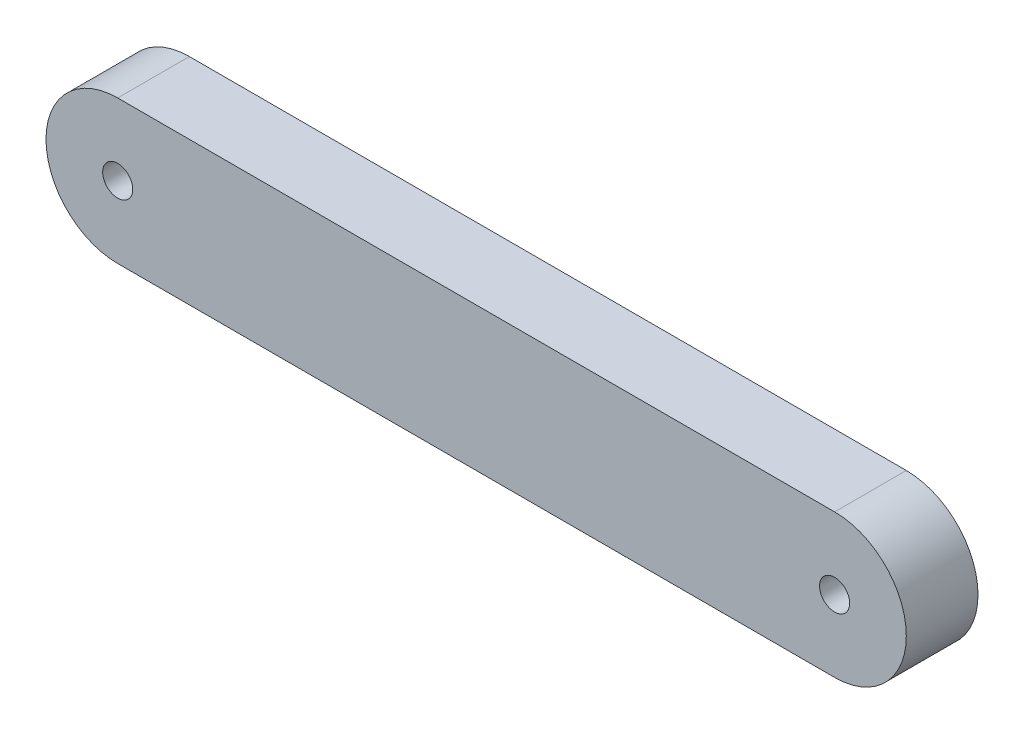
ISO-10303-21;
HEADER;
FILE_DESCRIPTION(('STEP AP214'),'2;1');
FILE_NAME('part.step','',(''),(''),'','','');
FILE_SCHEMA(('AUTOMOTIVE_DESIGN { 1 0 10303 214 1 1 1 1 }'));
ENDSEC;
DATA;
#1=APPLICATION_CONTEXT('core data for automotive mechanical design processes');
#2=APPLICATION_PROTOCOL_DEFINITION('international standard','automotive_design',2000,#1);
#3=PRODUCT_CONTEXT('',#1,'mechanical');
#4=PRODUCT('Part','Part','',(#3));
#5=PRODUCT_RELATED_PRODUCT_CATEGORY('part','',(#4));
#6=PRODUCT_DEFINITION_FORMATION('','',#4);
#7=PRODUCT_DEFINITION_CONTEXT('part definition',#1,'design');
#8=PRODUCT_DEFINITION('design','',#6,#7);
#9=PRODUCT_DEFINITION_SHAPE('','',#8);
#10=(LENGTH_UNIT() NAMED_UNIT(*) SI_UNIT(.MILLI.,.METRE.));
#11=(NAMED_UNIT(*) PLANE_ANGLE_UNIT() SI_UNIT($,.RADIAN.));
#12=(NAMED_UNIT(*) SI_UNIT($,.STERADIAN.) SOLID_ANGLE_UNIT());
#13=UNCERTAINTY_MEASURE_WITH_UNIT(LENGTH_MEASURE(1.E-05),#10,'distance_accuracy_value','');
#14=(GEOMETRIC_REPRESENTATION_CONTEXT(3) GLOBAL_UNCERTAINTY_ASSIGNED_CONTEXT((#13)) GLOBAL_UNIT_ASSIGNED_CONTEXT((#10,
#11,#12)) REPRESENTATION_CONTEXT('',''));
#15=CARTESIAN_POINT('',(0.,0.,0.));
#16=DIRECTION('',(0.,0.,1.));
#17=DIRECTION('',(1.,0.,0.));
#18=AXIS2_PLACEMENT_3D('',#15,#16,#17);
#19=CARTESIAN_POINT('',(-25.,0.,5.));
#20=DIRECTION('',(0.,0.,-1.));
#21=DIRECTION('',(-1.,0.,0.));
#22=AXIS2_PLACEMENT_3D('',#19,#20,#21);
#23=CYLINDRICAL_SURFACE('',#22,5.);
#24=CARTESIAN_POINT('',(-25.,0.,0.));
#25=DIRECTION('',(0.,0.,1.));
#26=DIRECTION('',(1.,0.,0.));
#27=AXIS2_PLACEMENT_3D('',#24,#25,#26);
#28=CIRCLE('',#27,5.);
#29=CARTESIAN_POINT('',(-25.,4.99999999999999,0.));
#30=VERTEX_POINT('',#29);
#31=CARTESIAN_POINT('',(-25.,-5.,0.));
#32=VERTEX_POINT('',#31);
#33=EDGE_CURVE('E105',#30,#32,#28,.T.);
#34=ORIENTED_EDGE('',*,*,#33,.T.);
#35=DIRECTION('',(0.,0.,-1.));
#36=VECTOR('',#35,1.);
#37=CARTESIAN_POINT('',(-25.,-5.,5.));
#38=LINE('',#37,#36);
#39=CARTESIAN_POINT('',(-25.,-5.,5.));
#40=VERTEX_POINT('',#39);
#41=EDGE_CURVE('E11',#40,#32,#38,.T.);
#42=ORIENTED_EDGE('',*,*,#41,.F.);
#43=CARTESIAN_POINT('',(-25.,0.,5.));
#44=DIRECTION('',(0.,0.,1.));
#45=DIRECTION('',(1.,0.,0.));
#46=AXIS2_PLACEMENT_3D('',#43,#44,#45);
#47=CIRCLE('',#46,5.);
#48=CARTESIAN_POINT('',(-25.,4.99999999999999,5.));
#49=VERTEX_POINT('',#48);
#50=EDGE_CURVE('E90',#49,#40,#47,.T.);
#51=ORIENTED_EDGE('',*,*,#50,.F.);
#52=DIRECTION('',(0.,0.,-1.));
#53=VECTOR('',#52,1.);
#54=CARTESIAN_POINT('',(-25.,4.99999999999999,5.));
#55=LINE('',#54,#53);
#56=EDGE_CURVE('E57',#49,#30,#55,.T.);
#57=ORIENTED_EDGE('',*,*,#56,.T.);
#58=EDGE_LOOP('',(#34,#42,#51,#57));
#59=FACE_BOUND('',#58,.T.);
#60=ADVANCED_FACE('F39',(#59),#23,.T.);
#61=CARTESIAN_POINT('',(0.,-5.,5.));
#62=DIRECTION('',(0.,1.,0.));
#63=DIRECTION('',(-1.,0.,0.));
#64=AXIS2_PLACEMENT_3D('',#61,#62,#63);
#65=PLANE('',#64);
#66=DIRECTION('',(1.,0.,0.));
#67=VECTOR('',#66,1.);
#68=CARTESIAN_POINT('',(0.,-5.,0.));
#69=LINE('',#68,#67);
#70=CARTESIAN_POINT('',(25.,-5.,0.));
#71=VERTEX_POINT('',#70);
#72=EDGE_CURVE('E95',#32,#71,#69,.T.);
#73=ORIENTED_EDGE('',*,*,#72,.T.);
#74=DIRECTION('',(0.,0.,-1.));
#75=VECTOR('',#74,1.);
#76=CARTESIAN_POINT('',(25.,-5.,5.));
#77=LINE('',#76,#75);
#78=CARTESIAN_POINT('',(25.,-5.,5.));
#79=VERTEX_POINT('',#78);
#80=EDGE_CURVE('E48',#79,#71,#77,.T.);
#81=ORIENTED_EDGE('',*,*,#80,.F.);
#82=DIRECTION('',(1.,0.,0.));
#83=VECTOR('',#82,1.);
#84=CARTESIAN_POINT('',(0.,-5.,5.));
#85=LINE('',#84,#83);
#86=EDGE_CURVE('E83',#40,#79,#85,.T.);
#87=ORIENTED_EDGE('',*,*,#86,.F.);
#88=ORIENTED_EDGE('',*,*,#41,.T.);
#89=EDGE_LOOP('',(#73,#81,#87,#88));
#90=FACE_BOUND('',#89,.T.);
#91=ADVANCED_FACE('F94',(#90),#65,.F.);
#92=CARTESIAN_POINT('',(25.,0.,5.));
#93=DIRECTION('',(0.,0.,-1.));
#94=DIRECTION('',(-1.,0.,0.));
#95=AXIS2_PLACEMENT_3D('',#92,#93,#94);
#96=CYLINDRICAL_SURFACE('',#95,5.);
#97=CARTESIAN_POINT('',(25.,0.,0.));
#98=DIRECTION('',(0.,0.,1.));
#99=DIRECTION('',(1.,0.,0.));
#100=AXIS2_PLACEMENT_3D('',#97,#98,#99);
#101=CIRCLE('',#100,5.);
#102=CARTESIAN_POINT('',(25.,5.,0.));
#103=VERTEX_POINT('',#102);
#104=EDGE_CURVE('E108',#71,#103,#101,.T.);
#105=ORIENTED_EDGE('',*,*,#104,.T.);
#106=DIRECTION('',(0.,0.,-1.));
#107=VECTOR('',#106,1.);
#108=CARTESIAN_POINT('',(25.,5.,5.));
#109=LINE('',#108,#107);
#110=CARTESIAN_POINT('',(25.,5.,5.));
#111=VERTEX_POINT('',#110);
#112=EDGE_CURVE('E72',#111,#103,#109,.T.);
#113=ORIENTED_EDGE('',*,*,#112,.F.);
#114=CARTESIAN_POINT('',(25.,0.,5.));
#115=DIRECTION('',(0.,0.,1.));
#116=DIRECTION('',(1.,0.,0.));
#117=AXIS2_PLACEMENT_3D('',#114,#115,#116);
#118=CIRCLE('',#117,5.);
#119=EDGE_CURVE('E89',#79,#111,#118,.T.);
#120=ORIENTED_EDGE('',*,*,#119,.F.);
#121=ORIENTED_EDGE('',*,*,#80,.T.);
#122=EDGE_LOOP('',(#105,#113,#120,#121));
#123=FACE_BOUND('',#122,.T.);
#124=ADVANCED_FACE('F99',(#123),#96,.T.);
#125=CARTESIAN_POINT('',(0.,5.,5.));
#126=DIRECTION('',(0.,1.,0.));
#127=DIRECTION('',(-1.,0.,0.));
#128=AXIS2_PLACEMENT_3D('',#125,#126,#127);
#129=PLANE('',#128);
#130=DIRECTION('',(1.,0.,0.));
#131=VECTOR('',#130,1.);
#132=CARTESIAN_POINT('',(0.,5.,0.));
#133=LINE('',#132,#131);
#134=EDGE_CURVE('E110',#30,#103,#133,.T.);
#135=ORIENTED_EDGE('',*,*,#134,.F.);
#136=ORIENTED_EDGE('',*,*,#56,.F.);
#137=DIRECTION('',(1.,0.,0.));
#138=VECTOR('',#137,1.);
#139=CARTESIAN_POINT('',(0.,5.,5.));
#140=LINE('',#139,#138);
#141=EDGE_CURVE('E100',#49,#111,#140,.T.);
#142=ORIENTED_EDGE('',*,*,#141,.T.);
#143=ORIENTED_EDGE('',*,*,#112,.T.);
#144=EDGE_LOOP('',(#135,#136,#142,#143));
#145=FACE_BOUND('',#144,.T.);
#146=ADVANCED_FACE('F133',(#145),#129,.T.);
#147=CARTESIAN_POINT('',(0.,0.,5.));
#148=DIRECTION('',(0.,0.,1.));
#149=DIRECTION('',(1.,0.,0.));
#150=AXIS2_PLACEMENT_3D('',#147,#148,#149);
#151=PLANE('',#150);
#152=CARTESIAN_POINT('',(-25.,0.,5.));
#153=DIRECTION('',(0.,0.,1.));
#154=DIRECTION('',(1.,0.,0.));
#155=AXIS2_PLACEMENT_3D('',#152,#153,#154);
#156=CIRCLE('',#155,1.05);
#157=CARTESIAN_POINT('',(-23.95,0.,5.));
#158=VERTEX_POINT('',#157);
#159=EDGE_CURVE('E116',#158,#158,#156,.T.);
#160=ORIENTED_EDGE('',*,*,#159,.F.);
#161=EDGE_LOOP('',(#160));
#162=FACE_BOUND('',#161,.T.);
#163=CARTESIAN_POINT('',(25.,0.,5.));
#164=DIRECTION('',(0.,0.,1.));
#165=DIRECTION('',(1.,0.,0.));
#166=AXIS2_PLACEMENT_3D('',#163,#164,#165);
#167=CIRCLE('',#166,1.05);
#168=CARTESIAN_POINT('',(26.05,0.,5.));
#169=VERTEX_POINT('',#168);
#170=EDGE_CURVE('E121',#169,#169,#167,.T.);
#171=ORIENTED_EDGE('',*,*,#170,.F.);
#172=EDGE_LOOP('',(#171));
#173=FACE_BOUND('',#172,.T.);
#174=ORIENTED_EDGE('',*,*,#50,.T.);
#175=ORIENTED_EDGE('',*,*,#86,.T.);
#176=ORIENTED_EDGE('',*,*,#119,.T.);
#177=ORIENTED_EDGE('',*,*,#141,.F.);
#178=EDGE_LOOP('',(#174,#175,#176,#177));
#179=FACE_BOUND('',#178,.T.);
#180=ADVANCED_FACE('F86',(#162,#173,#179),#151,.T.);
#181=CARTESIAN_POINT('',(0.,0.,0.));
#182=DIRECTION('',(0.,0.,1.));
#183=DIRECTION('',(1.,0.,0.));
#184=AXIS2_PLACEMENT_3D('',#181,#182,#183);
#185=PLANE('',#184);
#186=CARTESIAN_POINT('',(-25.,0.,0.));
#187=DIRECTION('',(0.,0.,1.));
#188=DIRECTION('',(1.,0.,0.));
#189=AXIS2_PLACEMENT_3D('',#186,#187,#188);
#190=CIRCLE('',#189,1.05);
#191=CARTESIAN_POINT('',(-23.95,0.,0.));
#192=VERTEX_POINT('',#191);
#193=EDGE_CURVE('E42',#192,#192,#190,.F.);
#194=ORIENTED_EDGE('',*,*,#193,.F.);
#195=EDGE_LOOP('',(#194));
#196=FACE_BOUND('',#195,.T.);
#197=CARTESIAN_POINT('',(25.,0.,0.));
#198=DIRECTION('',(0.,0.,1.));
#199=DIRECTION('',(1.,0.,0.));
#200=AXIS2_PLACEMENT_3D('',#197,#198,#199);
#201=CIRCLE('',#200,1.05);
#202=CARTESIAN_POINT('',(26.05,0.,0.));
#203=VERTEX_POINT('',#202);
#204=EDGE_CURVE('E114',#203,#203,#201,.F.);
#205=ORIENTED_EDGE('',*,*,#204,.F.);
#206=EDGE_LOOP('',(#205));
#207=FACE_BOUND('',#206,.T.);
#208=ORIENTED_EDGE('',*,*,#33,.F.);
#209=ORIENTED_EDGE('',*,*,#134,.T.);
#210=ORIENTED_EDGE('',*,*,#104,.F.);
#211=ORIENTED_EDGE('',*,*,#72,.F.);
#212=EDGE_LOOP('',(#208,#209,#210,#211));
#213=FACE_BOUND('',#212,.T.);
#214=ADVANCED_FACE('F132',(#196,#207,#213),#185,.F.);
#215=CARTESIAN_POINT('',(25.,0.,5.));
#216=DIRECTION('',(0.,0.,-1.));
#217=DIRECTION('',(-1.,0.,0.));
#218=AXIS2_PLACEMENT_3D('',#215,#216,#217);
#219=CYLINDRICAL_SURFACE('',#218,1.05);
#220=ORIENTED_EDGE('',*,*,#170,.T.);
#221=EDGE_LOOP('',(#220));
#222=FACE_BOUND('',#221,.T.);
#223=ORIENTED_EDGE('',*,*,#204,.T.);
#224=EDGE_LOOP('',(#223));
#225=FACE_BOUND('',#224,.T.);
#226=ADVANCED_FACE('F129',(#222,#225),#219,.F.);
#227=CARTESIAN_POINT('',(-25.,0.,5.));
#228=DIRECTION('',(0.,0.,-1.));
#229=DIRECTION('',(-1.,0.,0.));
#230=AXIS2_PLACEMENT_3D('',#227,#228,#229);
#231=CYLINDRICAL_SURFACE('',#230,1.05);
#232=ORIENTED_EDGE('',*,*,#159,.T.);
#233=EDGE_LOOP('',(#232));
#234=FACE_BOUND('',#233,.T.);
#235=ORIENTED_EDGE('',*,*,#193,.T.);
#236=EDGE_LOOP('',(#235));
#237=FACE_BOUND('',#236,.T.);
#238=ADVANCED_FACE('F183',(#234,#237),#231,.F.);
#239=CLOSED_SHELL('',(#60,#91,#124,#146,#180,#214,#226,#238));
#240=MANIFOLD_SOLID_BREP('B2',#239);
#241=ADVANCED_BREP_SHAPE_REPRESENTATION('',(#18,#240),#14);
#242=SHAPE_DEFINITION_REPRESENTATION(#9,#241);
ENDSEC;
END-ISO-10303-21;
